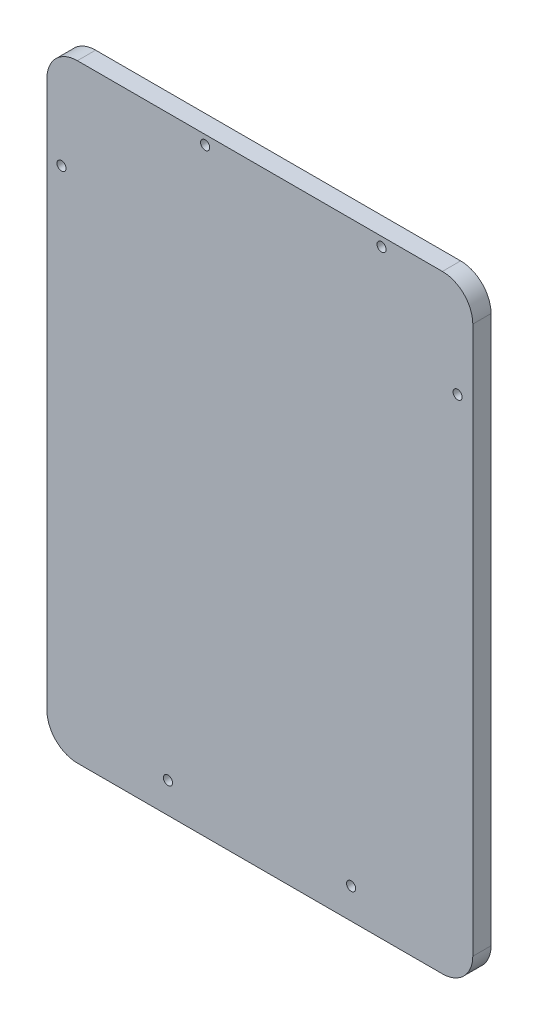
ISO-10303-21;
HEADER;
FILE_DESCRIPTION(('STEP AP214'),'2;1');
FILE_NAME('part.step','',(''),(''),'','','');
FILE_SCHEMA(('AUTOMOTIVE_DESIGN { 1 0 10303 214 1 1 1 1 }'));
ENDSEC;
DATA;
#1=APPLICATION_CONTEXT('core data for automotive mechanical design processes');
#2=APPLICATION_PROTOCOL_DEFINITION('international standard','automotive_design',2000,#1);
#3=PRODUCT_CONTEXT('',#1,'mechanical');
#4=PRODUCT('Part','Part','',(#3));
#5=PRODUCT_RELATED_PRODUCT_CATEGORY('part','',(#4));
#6=PRODUCT_DEFINITION_FORMATION('','',#4);
#7=PRODUCT_DEFINITION_CONTEXT('part definition',#1,'design');
#8=PRODUCT_DEFINITION('design','',#6,#7);
#9=PRODUCT_DEFINITION_SHAPE('','',#8);
#10=(LENGTH_UNIT() NAMED_UNIT(*) SI_UNIT(.MILLI.,.METRE.));
#11=(NAMED_UNIT(*) PLANE_ANGLE_UNIT() SI_UNIT($,.RADIAN.));
#12=(NAMED_UNIT(*) SI_UNIT($,.STERADIAN.) SOLID_ANGLE_UNIT());
#13=UNCERTAINTY_MEASURE_WITH_UNIT(LENGTH_MEASURE(1.E-05),#10,'distance_accuracy_value','');
#14=(GEOMETRIC_REPRESENTATION_CONTEXT(3) GLOBAL_UNCERTAINTY_ASSIGNED_CONTEXT((#13)) GLOBAL_UNIT_ASSIGNED_CONTEXT((#10,
#11,#12)) REPRESENTATION_CONTEXT('',''));
#15=CARTESIAN_POINT('',(0.,0.,0.));
#16=DIRECTION('',(0.,0.,1.));
#17=DIRECTION('',(1.,0.,0.));
#18=AXIS2_PLACEMENT_3D('',#15,#16,#17);
#19=CARTESIAN_POINT('',(0.,0.,6.));
#20=DIRECTION('',(1.,0.,0.));
#21=DIRECTION('',(0.,0.,-1.));
#22=AXIS2_PLACEMENT_3D('',#19,#20,#21);
#23=PLANE('',#22);
#24=DIRECTION('',(0.,-1.,0.));
#25=VECTOR('',#24,1.);
#26=CARTESIAN_POINT('',(0.,0.,0.));
#27=LINE('',#26,#25);
#28=CARTESIAN_POINT('',(0.,190.,0.));
#29=VERTEX_POINT('',#28);
#30=CARTESIAN_POINT('',(0.,10.,0.));
#31=VERTEX_POINT('',#30);
#32=EDGE_CURVE('E134',#29,#31,#27,.T.);
#33=ORIENTED_EDGE('',*,*,#32,.T.);
#34=DIRECTION('',(0.,0.,-1.));
#35=VECTOR('',#34,1.);
#36=CARTESIAN_POINT('',(0.,10.,6.));
#37=LINE('',#36,#35);
#38=CARTESIAN_POINT('',(0.,10.,6.));
#39=VERTEX_POINT('',#38);
#40=EDGE_CURVE('E109',#31,#39,#37,.F.);
#41=ORIENTED_EDGE('',*,*,#40,.T.);
#42=DIRECTION('',(0.,-1.,0.));
#43=VECTOR('',#42,1.);
#44=CARTESIAN_POINT('',(0.,0.,6.));
#45=LINE('',#44,#43);
#46=CARTESIAN_POINT('',(0.,190.,6.));
#47=VERTEX_POINT('',#46);
#48=EDGE_CURVE('E147',#47,#39,#45,.T.);
#49=ORIENTED_EDGE('',*,*,#48,.F.);
#50=DIRECTION('',(0.,0.,-1.));
#51=VECTOR('',#50,1.);
#52=CARTESIAN_POINT('',(0.,190.,6.));
#53=LINE('',#52,#51);
#54=EDGE_CURVE('E115',#47,#29,#53,.T.);
#55=ORIENTED_EDGE('',*,*,#54,.T.);
#56=EDGE_LOOP('',(#33,#41,#49,#55));
#57=FACE_BOUND('',#56,.T.);
#58=ADVANCED_FACE('F38',(#57),#23,.F.);
#59=CARTESIAN_POINT('',(0.,0.,6.));
#60=DIRECTION('',(0.,1.,0.));
#61=DIRECTION('',(0.,0.,1.));
#62=AXIS2_PLACEMENT_3D('',#59,#60,#61);
#63=PLANE('',#62);
#64=DIRECTION('',(1.,0.,0.));
#65=VECTOR('',#64,1.);
#66=CARTESIAN_POINT('',(0.,0.,6.));
#67=LINE('',#66,#65);
#68=CARTESIAN_POINT('',(10.,0.,6.));
#69=VERTEX_POINT('',#68);
#70=CARTESIAN_POINT('',(130.,0.,6.));
#71=VERTEX_POINT('',#70);
#72=EDGE_CURVE('E125',#69,#71,#67,.T.);
#73=ORIENTED_EDGE('',*,*,#72,.F.);
#74=DIRECTION('',(0.,0.,-1.));
#75=VECTOR('',#74,1.);
#76=CARTESIAN_POINT('',(10.,0.,6.));
#77=LINE('',#76,#75);
#78=CARTESIAN_POINT('',(10.,0.,0.));
#79=VERTEX_POINT('',#78);
#80=EDGE_CURVE('E108',#69,#79,#77,.T.);
#81=ORIENTED_EDGE('',*,*,#80,.T.);
#82=DIRECTION('',(1.,0.,0.));
#83=VECTOR('',#82,1.);
#84=CARTESIAN_POINT('',(0.,0.,0.));
#85=LINE('',#84,#83);
#86=CARTESIAN_POINT('',(130.,0.,0.));
#87=VERTEX_POINT('',#86);
#88=EDGE_CURVE('E122',#79,#87,#85,.T.);
#89=ORIENTED_EDGE('',*,*,#88,.T.);
#90=DIRECTION('',(0.,0.,-1.));
#91=VECTOR('',#90,1.);
#92=CARTESIAN_POINT('',(130.,0.,6.));
#93=LINE('',#92,#91);
#94=EDGE_CURVE('E128',#87,#71,#93,.F.);
#95=ORIENTED_EDGE('',*,*,#94,.T.);
#96=EDGE_LOOP('',(#73,#81,#89,#95));
#97=FACE_BOUND('',#96,.T.);
#98=ADVANCED_FACE('F121',(#97),#63,.F.);
#99=CARTESIAN_POINT('',(140.,0.,6.));
#100=DIRECTION('',(-1.,0.,0.));
#101=DIRECTION('',(0.,-1.,0.));
#102=AXIS2_PLACEMENT_3D('',#99,#100,#101);
#103=PLANE('',#102);
#104=DIRECTION('',(0.,1.,0.));
#105=VECTOR('',#104,1.);
#106=CARTESIAN_POINT('',(140.,0.,6.));
#107=LINE('',#106,#105);
#108=CARTESIAN_POINT('',(140.,10.,6.));
#109=VERTEX_POINT('',#108);
#110=CARTESIAN_POINT('',(140.,190.,6.));
#111=VERTEX_POINT('',#110);
#112=EDGE_CURVE('E196',#109,#111,#107,.T.);
#113=ORIENTED_EDGE('',*,*,#112,.F.);
#114=DIRECTION('',(0.,0.,-1.));
#115=VECTOR('',#114,1.);
#116=CARTESIAN_POINT('',(140.,10.,6.));
#117=LINE('',#116,#115);
#118=CARTESIAN_POINT('',(140.,10.,0.));
#119=VERTEX_POINT('',#118);
#120=EDGE_CURVE('E177',#109,#119,#117,.T.);
#121=ORIENTED_EDGE('',*,*,#120,.T.);
#122=DIRECTION('',(0.,1.,0.));
#123=VECTOR('',#122,1.);
#124=CARTESIAN_POINT('',(140.,0.,0.));
#125=LINE('',#124,#123);
#126=CARTESIAN_POINT('',(140.,190.,0.));
#127=VERTEX_POINT('',#126);
#128=EDGE_CURVE('E133',#119,#127,#125,.T.);
#129=ORIENTED_EDGE('',*,*,#128,.T.);
#130=DIRECTION('',(0.,0.,-1.));
#131=VECTOR('',#130,1.);
#132=CARTESIAN_POINT('',(140.,190.,6.));
#133=LINE('',#132,#131);
#134=EDGE_CURVE('E174',#127,#111,#133,.F.);
#135=ORIENTED_EDGE('',*,*,#134,.T.);
#136=EDGE_LOOP('',(#113,#121,#129,#135));
#137=FACE_BOUND('',#136,.T.);
#138=ADVANCED_FACE('F214',(#137),#103,.F.);
#139=CARTESIAN_POINT('',(0.,200.,6.));
#140=DIRECTION('',(0.,-1.,0.));
#141=DIRECTION('',(0.,0.,-1.));
#142=AXIS2_PLACEMENT_3D('',#139,#140,#141);
#143=PLANE('',#142);
#144=DIRECTION('',(-1.,0.,0.));
#145=VECTOR('',#144,1.);
#146=CARTESIAN_POINT('',(0.,200.,0.));
#147=LINE('',#146,#145);
#148=CARTESIAN_POINT('',(130.,200.,0.));
#149=VERTEX_POINT('',#148);
#150=CARTESIAN_POINT('',(10.,200.,0.));
#151=VERTEX_POINT('',#150);
#152=EDGE_CURVE('E139',#149,#151,#147,.T.);
#153=ORIENTED_EDGE('',*,*,#152,.T.);
#154=DIRECTION('',(0.,0.,-1.));
#155=VECTOR('',#154,1.);
#156=CARTESIAN_POINT('',(10.,200.,6.));
#157=LINE('',#156,#155);
#158=CARTESIAN_POINT('',(10.,200.,6.));
#159=VERTEX_POINT('',#158);
#160=EDGE_CURVE('E11',#151,#159,#157,.F.);
#161=ORIENTED_EDGE('',*,*,#160,.T.);
#162=DIRECTION('',(-1.,0.,0.));
#163=VECTOR('',#162,1.);
#164=CARTESIAN_POINT('',(0.,200.,6.));
#165=LINE('',#164,#163);
#166=CARTESIAN_POINT('',(130.,200.,6.));
#167=VERTEX_POINT('',#166);
#168=EDGE_CURVE('E149',#167,#159,#165,.T.);
#169=ORIENTED_EDGE('',*,*,#168,.F.);
#170=DIRECTION('',(0.,0.,-1.));
#171=VECTOR('',#170,1.);
#172=CARTESIAN_POINT('',(130.,200.,6.));
#173=LINE('',#172,#171);
#174=EDGE_CURVE('E47',#167,#149,#173,.T.);
#175=ORIENTED_EDGE('',*,*,#174,.T.);
#176=EDGE_LOOP('',(#153,#161,#169,#175));
#177=FACE_BOUND('',#176,.T.);
#178=ADVANCED_FACE('F184',(#177),#143,.F.);
#179=CARTESIAN_POINT('',(0.,0.,6.));
#180=DIRECTION('',(0.,0.,-1.));
#181=DIRECTION('',(-1.,0.,0.));
#182=AXIS2_PLACEMENT_3D('',#179,#180,#181);
#183=PLANE('',#182);
#184=CARTESIAN_POINT('',(110.,196.990300428617,6.));
#185=DIRECTION('',(0.,0.,-1.));
#186=DIRECTION('',(-1.,0.,0.));
#187=AXIS2_PLACEMENT_3D('',#184,#185,#186);
#188=CIRCLE('',#187,1.5);
#189=CARTESIAN_POINT('',(108.5,196.990300428617,6.));
#190=VERTEX_POINT('',#189);
#191=EDGE_CURVE('E339',#190,#190,#188,.T.);
#192=ORIENTED_EDGE('',*,*,#191,.T.);
#193=EDGE_LOOP('',(#192));
#194=FACE_BOUND('',#193,.T.);
#195=CARTESIAN_POINT('',(52.,196.990300428617,6.));
#196=DIRECTION('',(0.,0.,-1.));
#197=DIRECTION('',(-1.,0.,0.));
#198=AXIS2_PLACEMENT_3D('',#195,#196,#197);
#199=CIRCLE('',#198,1.5);
#200=CARTESIAN_POINT('',(50.5,196.990300428617,6.));
#201=VERTEX_POINT('',#200);
#202=EDGE_CURVE('E342',#201,#201,#199,.T.);
#203=ORIENTED_EDGE('',*,*,#202,.T.);
#204=EDGE_LOOP('',(#203));
#205=FACE_BOUND('',#204,.T.);
#206=CARTESIAN_POINT('',(135.,167.45,6.));
#207=DIRECTION('',(0.,0.,-1.));
#208=DIRECTION('',(-1.,0.,0.));
#209=AXIS2_PLACEMENT_3D('',#206,#207,#208);
#210=CIRCLE('',#209,1.5);
#211=CARTESIAN_POINT('',(133.5,167.45,6.));
#212=VERTEX_POINT('',#211);
#213=EDGE_CURVE('E141',#212,#212,#210,.T.);
#214=ORIENTED_EDGE('',*,*,#213,.T.);
#215=EDGE_LOOP('',(#214));
#216=FACE_BOUND('',#215,.T.);
#217=CARTESIAN_POINT('',(4.78000000000003,167.45,6.));
#218=DIRECTION('',(0.,0.,-1.));
#219=DIRECTION('',(-1.,0.,0.));
#220=AXIS2_PLACEMENT_3D('',#217,#218,#219);
#221=CIRCLE('',#220,1.5);
#222=CARTESIAN_POINT('',(3.28000000000002,167.45,6.));
#223=VERTEX_POINT('',#222);
#224=EDGE_CURVE('E371',#223,#223,#221,.T.);
#225=ORIENTED_EDGE('',*,*,#224,.T.);
#226=EDGE_LOOP('',(#225));
#227=FACE_BOUND('',#226,.T.);
#228=CARTESIAN_POINT('',(39.78,10.,6.));
#229=DIRECTION('',(0.,0.,-1.));
#230=DIRECTION('',(-1.,0.,0.));
#231=AXIS2_PLACEMENT_3D('',#228,#229,#230);
#232=CIRCLE('',#231,1.5);
#233=CARTESIAN_POINT('',(38.28,10.,6.));
#234=VERTEX_POINT('',#233);
#235=EDGE_CURVE('E368',#234,#234,#232,.T.);
#236=ORIENTED_EDGE('',*,*,#235,.T.);
#237=EDGE_LOOP('',(#236));
#238=FACE_BOUND('',#237,.T.);
#239=CARTESIAN_POINT('',(100.,10.,6.));
#240=DIRECTION('',(0.,0.,-1.));
#241=DIRECTION('',(-1.,0.,0.));
#242=AXIS2_PLACEMENT_3D('',#239,#240,#241);
#243=CIRCLE('',#242,1.5);
#244=CARTESIAN_POINT('',(98.5,10.,6.));
#245=VERTEX_POINT('',#244);
#246=EDGE_CURVE('E364',#245,#245,#243,.T.);
#247=ORIENTED_EDGE('',*,*,#246,.T.);
#248=EDGE_LOOP('',(#247));
#249=FACE_BOUND('',#248,.T.);
#250=ORIENTED_EDGE('',*,*,#48,.T.);
#251=CARTESIAN_POINT('',(10.,10.,6.));
#252=DIRECTION('',(0.,0.,-1.));
#253=DIRECTION('',(-1.,0.,0.));
#254=AXIS2_PLACEMENT_3D('',#251,#252,#253);
#255=CIRCLE('',#254,10.);
#256=EDGE_CURVE('E171',#39,#69,#255,.F.);
#257=ORIENTED_EDGE('',*,*,#256,.T.);
#258=ORIENTED_EDGE('',*,*,#72,.T.);
#259=CARTESIAN_POINT('',(130.,10.,6.));
#260=DIRECTION('',(0.,0.,-1.));
#261=DIRECTION('',(-1.,0.,0.));
#262=AXIS2_PLACEMENT_3D('',#259,#260,#261);
#263=CIRCLE('',#262,10.);
#264=EDGE_CURVE('E168',#71,#109,#263,.F.);
#265=ORIENTED_EDGE('',*,*,#264,.T.);
#266=ORIENTED_EDGE('',*,*,#112,.T.);
#267=CARTESIAN_POINT('',(130.,190.,6.));
#268=DIRECTION('',(0.,0.,-1.));
#269=DIRECTION('',(-1.,0.,0.));
#270=AXIS2_PLACEMENT_3D('',#267,#268,#269);
#271=CIRCLE('',#270,10.);
#272=EDGE_CURVE('E59',#111,#167,#271,.F.);
#273=ORIENTED_EDGE('',*,*,#272,.T.);
#274=ORIENTED_EDGE('',*,*,#168,.T.);
#275=CARTESIAN_POINT('',(10.,190.,6.));
#276=DIRECTION('',(0.,0.,-1.));
#277=DIRECTION('',(-1.,0.,0.));
#278=AXIS2_PLACEMENT_3D('',#275,#276,#277);
#279=CIRCLE('',#278,10.);
#280=EDGE_CURVE('E165',#159,#47,#279,.F.);
#281=ORIENTED_EDGE('',*,*,#280,.T.);
#282=EDGE_LOOP('',(#250,#257,#258,#265,#266,#273,#274,#281));
#283=FACE_BOUND('',#282,.T.);
#284=ADVANCED_FACE('F203',(#194,#205,#216,#227,#238,#249,#283),#183,.F.);
#285=CARTESIAN_POINT('',(0.,0.,0.));
#286=DIRECTION('',(0.,0.,-1.));
#287=DIRECTION('',(-1.,0.,0.));
#288=AXIS2_PLACEMENT_3D('',#285,#286,#287);
#289=PLANE('',#288);
#290=CARTESIAN_POINT('',(110.,196.990300428617,0.));
#291=DIRECTION('',(0.,0.,-1.));
#292=DIRECTION('',(-1.,0.,0.));
#293=AXIS2_PLACEMENT_3D('',#290,#291,#292);
#294=CIRCLE('',#293,1.5);
#295=CARTESIAN_POINT('',(108.5,196.990300428617,0.));
#296=VERTEX_POINT('',#295);
#297=EDGE_CURVE('E337',#296,#296,#294,.T.);
#298=ORIENTED_EDGE('',*,*,#297,.F.);
#299=EDGE_LOOP('',(#298));
#300=FACE_BOUND('',#299,.T.);
#301=CARTESIAN_POINT('',(52.,196.990300428617,0.));
#302=DIRECTION('',(0.,0.,-1.));
#303=DIRECTION('',(-1.,0.,0.));
#304=AXIS2_PLACEMENT_3D('',#301,#302,#303);
#305=CIRCLE('',#304,1.5);
#306=CARTESIAN_POINT('',(50.5,196.990300428617,0.));
#307=VERTEX_POINT('',#306);
#308=EDGE_CURVE('E394',#307,#307,#305,.T.);
#309=ORIENTED_EDGE('',*,*,#308,.F.);
#310=EDGE_LOOP('',(#309));
#311=FACE_BOUND('',#310,.T.);
#312=CARTESIAN_POINT('',(135.,167.45,0.));
#313=DIRECTION('',(0.,0.,-1.));
#314=DIRECTION('',(-1.,0.,0.));
#315=AXIS2_PLACEMENT_3D('',#312,#313,#314);
#316=CIRCLE('',#315,1.5);
#317=CARTESIAN_POINT('',(133.5,167.45,0.));
#318=VERTEX_POINT('',#317);
#319=EDGE_CURVE('E341',#318,#318,#316,.T.);
#320=ORIENTED_EDGE('',*,*,#319,.F.);
#321=EDGE_LOOP('',(#320));
#322=FACE_BOUND('',#321,.T.);
#323=CARTESIAN_POINT('',(4.78000000000003,167.45,0.));
#324=DIRECTION('',(0.,0.,-1.));
#325=DIRECTION('',(-1.,0.,0.));
#326=AXIS2_PLACEMENT_3D('',#323,#324,#325);
#327=CIRCLE('',#326,1.5);
#328=CARTESIAN_POINT('',(3.28000000000002,167.45,0.));
#329=VERTEX_POINT('',#328);
#330=EDGE_CURVE('E347',#329,#329,#327,.T.);
#331=ORIENTED_EDGE('',*,*,#330,.F.);
#332=EDGE_LOOP('',(#331));
#333=FACE_BOUND('',#332,.T.);
#334=CARTESIAN_POINT('',(39.78,10.,0.));
#335=DIRECTION('',(0.,0.,-1.));
#336=DIRECTION('',(-1.,0.,0.));
#337=AXIS2_PLACEMENT_3D('',#334,#335,#336);
#338=CIRCLE('',#337,1.5);
#339=CARTESIAN_POINT('',(38.28,10.,0.));
#340=VERTEX_POINT('',#339);
#341=EDGE_CURVE('E353',#340,#340,#338,.T.);
#342=ORIENTED_EDGE('',*,*,#341,.F.);
#343=EDGE_LOOP('',(#342));
#344=FACE_BOUND('',#343,.T.);
#345=CARTESIAN_POINT('',(100.,10.,0.));
#346=DIRECTION('',(0.,0.,-1.));
#347=DIRECTION('',(-1.,0.,0.));
#348=AXIS2_PLACEMENT_3D('',#345,#346,#347);
#349=CIRCLE('',#348,1.5);
#350=CARTESIAN_POINT('',(98.5,10.,0.));
#351=VERTEX_POINT('',#350);
#352=EDGE_CURVE('E357',#351,#351,#349,.T.);
#353=ORIENTED_EDGE('',*,*,#352,.F.);
#354=EDGE_LOOP('',(#353));
#355=FACE_BOUND('',#354,.T.);
#356=ORIENTED_EDGE('',*,*,#88,.F.);
#357=CARTESIAN_POINT('',(10.,10.,0.));
#358=DIRECTION('',(0.,0.,-1.));
#359=DIRECTION('',(-1.,0.,0.));
#360=AXIS2_PLACEMENT_3D('',#357,#358,#359);
#361=CIRCLE('',#360,10.);
#362=EDGE_CURVE('E104',#79,#31,#361,.T.);
#363=ORIENTED_EDGE('',*,*,#362,.T.);
#364=ORIENTED_EDGE('',*,*,#32,.F.);
#365=CARTESIAN_POINT('',(10.,190.,0.));
#366=DIRECTION('',(0.,0.,-1.));
#367=DIRECTION('',(-1.,0.,0.));
#368=AXIS2_PLACEMENT_3D('',#365,#366,#367);
#369=CIRCLE('',#368,10.);
#370=EDGE_CURVE('E153',#29,#151,#369,.T.);
#371=ORIENTED_EDGE('',*,*,#370,.T.);
#372=ORIENTED_EDGE('',*,*,#152,.F.);
#373=CARTESIAN_POINT('',(130.,190.,0.));
#374=DIRECTION('',(0.,0.,-1.));
#375=DIRECTION('',(-1.,0.,0.));
#376=AXIS2_PLACEMENT_3D('',#373,#374,#375);
#377=CIRCLE('',#376,10.);
#378=EDGE_CURVE('E127',#149,#127,#377,.T.);
#379=ORIENTED_EDGE('',*,*,#378,.T.);
#380=ORIENTED_EDGE('',*,*,#128,.F.);
#381=CARTESIAN_POINT('',(130.,10.,0.));
#382=DIRECTION('',(0.,0.,-1.));
#383=DIRECTION('',(-1.,0.,0.));
#384=AXIS2_PLACEMENT_3D('',#381,#382,#383);
#385=CIRCLE('',#384,10.);
#386=EDGE_CURVE('E116',#119,#87,#385,.T.);
#387=ORIENTED_EDGE('',*,*,#386,.T.);
#388=EDGE_LOOP('',(#356,#363,#364,#371,#372,#379,#380,#387));
#389=FACE_BOUND('',#388,.T.);
#390=ADVANCED_FACE('F130',(#300,#311,#322,#333,#344,#355,#389),#289,.T.);
#391=CARTESIAN_POINT('',(10.,10.,6.));
#392=DIRECTION('',(0.,0.,-1.));
#393=DIRECTION('',(-1.,0.,0.));
#394=AXIS2_PLACEMENT_3D('',#391,#392,#393);
#395=CYLINDRICAL_SURFACE('',#394,10.);
#396=ORIENTED_EDGE('',*,*,#256,.F.);
#397=ORIENTED_EDGE('',*,*,#40,.F.);
#398=ORIENTED_EDGE('',*,*,#362,.F.);
#399=ORIENTED_EDGE('',*,*,#80,.F.);
#400=EDGE_LOOP('',(#396,#397,#398,#399));
#401=FACE_BOUND('',#400,.T.);
#402=ADVANCED_FACE('F107',(#401),#395,.T.);
#403=CARTESIAN_POINT('',(130.,10.,6.));
#404=DIRECTION('',(0.,0.,-1.));
#405=DIRECTION('',(-1.,0.,0.));
#406=AXIS2_PLACEMENT_3D('',#403,#404,#405);
#407=CYLINDRICAL_SURFACE('',#406,10.);
#408=ORIENTED_EDGE('',*,*,#264,.F.);
#409=ORIENTED_EDGE('',*,*,#94,.F.);
#410=ORIENTED_EDGE('',*,*,#386,.F.);
#411=ORIENTED_EDGE('',*,*,#120,.F.);
#412=EDGE_LOOP('',(#408,#409,#410,#411));
#413=FACE_BOUND('',#412,.T.);
#414=ADVANCED_FACE('F229',(#413),#407,.T.);
#415=CARTESIAN_POINT('',(10.,190.,6.));
#416=DIRECTION('',(0.,0.,-1.));
#417=DIRECTION('',(-1.,0.,0.));
#418=AXIS2_PLACEMENT_3D('',#415,#416,#417);
#419=CYLINDRICAL_SURFACE('',#418,10.);
#420=ORIENTED_EDGE('',*,*,#280,.F.);
#421=ORIENTED_EDGE('',*,*,#160,.F.);
#422=ORIENTED_EDGE('',*,*,#370,.F.);
#423=ORIENTED_EDGE('',*,*,#54,.F.);
#424=EDGE_LOOP('',(#420,#421,#422,#423));
#425=FACE_BOUND('',#424,.T.);
#426=ADVANCED_FACE('F189',(#425),#419,.T.);
#427=CARTESIAN_POINT('',(130.,190.,6.));
#428=DIRECTION('',(0.,0.,-1.));
#429=DIRECTION('',(-1.,0.,0.));
#430=AXIS2_PLACEMENT_3D('',#427,#428,#429);
#431=CYLINDRICAL_SURFACE('',#430,10.);
#432=ORIENTED_EDGE('',*,*,#272,.F.);
#433=ORIENTED_EDGE('',*,*,#134,.F.);
#434=ORIENTED_EDGE('',*,*,#378,.F.);
#435=ORIENTED_EDGE('',*,*,#174,.F.);
#436=EDGE_LOOP('',(#432,#433,#434,#435));
#437=FACE_BOUND('',#436,.T.);
#438=ADVANCED_FACE('F40',(#437),#431,.T.);
#439=CARTESIAN_POINT('',(100.,10.,10.));
#440=DIRECTION('',(0.,0.,-1.));
#441=DIRECTION('',(-1.,0.,0.));
#442=AXIS2_PLACEMENT_3D('',#439,#440,#441);
#443=CYLINDRICAL_SURFACE('',#442,1.5);
#444=ORIENTED_EDGE('',*,*,#352,.T.);
#445=EDGE_LOOP('',(#444));
#446=FACE_BOUND('',#445,.T.);
#447=ORIENTED_EDGE('',*,*,#246,.F.);
#448=EDGE_LOOP('',(#447));
#449=FACE_BOUND('',#448,.T.);
#450=ADVANCED_FACE('F236',(#446,#449),#443,.F.);
#451=CARTESIAN_POINT('',(39.78,10.,10.));
#452=DIRECTION('',(0.,0.,-1.));
#453=DIRECTION('',(-1.,0.,0.));
#454=AXIS2_PLACEMENT_3D('',#451,#452,#453);
#455=CYLINDRICAL_SURFACE('',#454,1.5);
#456=ORIENTED_EDGE('',*,*,#341,.T.);
#457=EDGE_LOOP('',(#456));
#458=FACE_BOUND('',#457,.T.);
#459=ORIENTED_EDGE('',*,*,#235,.F.);
#460=EDGE_LOOP('',(#459));
#461=FACE_BOUND('',#460,.T.);
#462=ADVANCED_FACE('F240',(#458,#461),#455,.F.);
#463=CARTESIAN_POINT('',(4.78000000000003,167.45,10.));
#464=DIRECTION('',(0.,0.,-1.));
#465=DIRECTION('',(-1.,0.,0.));
#466=AXIS2_PLACEMENT_3D('',#463,#464,#465);
#467=CYLINDRICAL_SURFACE('',#466,1.5);
#468=ORIENTED_EDGE('',*,*,#330,.T.);
#469=EDGE_LOOP('',(#468));
#470=FACE_BOUND('',#469,.T.);
#471=ORIENTED_EDGE('',*,*,#224,.F.);
#472=EDGE_LOOP('',(#471));
#473=FACE_BOUND('',#472,.T.);
#474=ADVANCED_FACE('F291',(#470,#473),#467,.F.);
#475=CARTESIAN_POINT('',(135.,167.45,10.));
#476=DIRECTION('',(0.,0.,-1.));
#477=DIRECTION('',(-1.,0.,0.));
#478=AXIS2_PLACEMENT_3D('',#475,#476,#477);
#479=CYLINDRICAL_SURFACE('',#478,1.5);
#480=ORIENTED_EDGE('',*,*,#319,.T.);
#481=EDGE_LOOP('',(#480));
#482=FACE_BOUND('',#481,.T.);
#483=ORIENTED_EDGE('',*,*,#213,.F.);
#484=EDGE_LOOP('',(#483));
#485=FACE_BOUND('',#484,.T.);
#486=ADVANCED_FACE('F300',(#482,#485),#479,.F.);
#487=CARTESIAN_POINT('',(52.,196.990300428617,10.));
#488=DIRECTION('',(0.,0.,-1.));
#489=DIRECTION('',(-1.,0.,0.));
#490=AXIS2_PLACEMENT_3D('',#487,#488,#489);
#491=CYLINDRICAL_SURFACE('',#490,1.5);
#492=ORIENTED_EDGE('',*,*,#308,.T.);
#493=EDGE_LOOP('',(#492));
#494=FACE_BOUND('',#493,.T.);
#495=ORIENTED_EDGE('',*,*,#202,.F.);
#496=EDGE_LOOP('',(#495));
#497=FACE_BOUND('',#496,.T.);
#498=ADVANCED_FACE('F309',(#494,#497),#491,.F.);
#499=CARTESIAN_POINT('',(110.,196.990300428617,10.));
#500=DIRECTION('',(0.,0.,-1.));
#501=DIRECTION('',(-1.,0.,0.));
#502=AXIS2_PLACEMENT_3D('',#499,#500,#501);
#503=CYLINDRICAL_SURFACE('',#502,1.5);
#504=ORIENTED_EDGE('',*,*,#297,.T.);
#505=EDGE_LOOP('',(#504));
#506=FACE_BOUND('',#505,.T.);
#507=ORIENTED_EDGE('',*,*,#191,.F.);
#508=EDGE_LOOP('',(#507));
#509=FACE_BOUND('',#508,.T.);
#510=ADVANCED_FACE('F320',(#506,#509),#503,.F.);
#511=CLOSED_SHELL('',(#58,#98,#138,#178,#284,#390,#402,#414,#426,#438,#450,#462,#474,#486,#498,#510));
#512=MANIFOLD_SOLID_BREP('B2',#511);
#513=ADVANCED_BREP_SHAPE_REPRESENTATION('',(#18,#512),#14);
#514=SHAPE_DEFINITION_REPRESENTATION(#9,#513);
ENDSEC;
END-ISO-10303-21;
